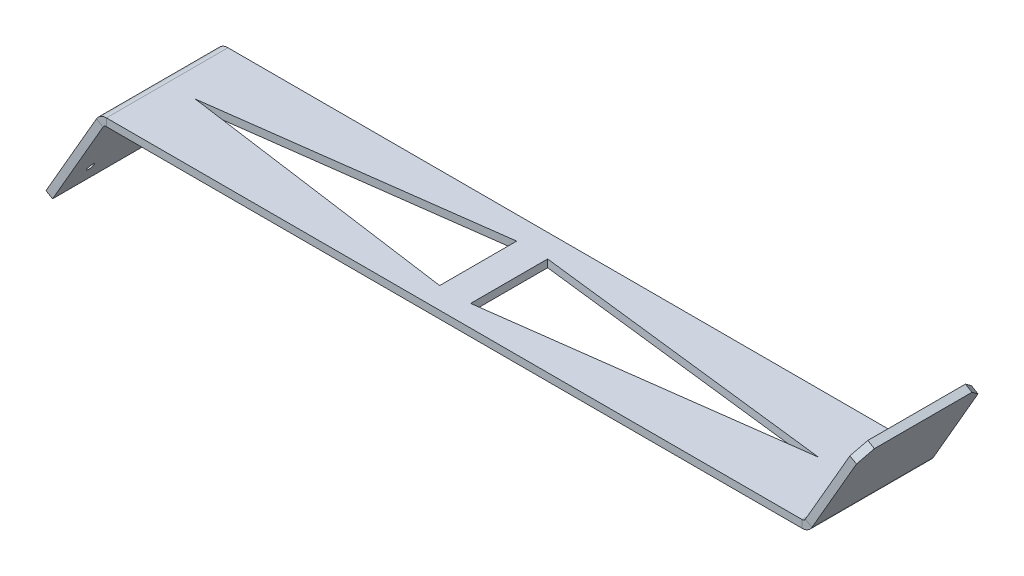
ISO-10303-21;
HEADER;
FILE_DESCRIPTION(('STEP AP214'),'2;1');
FILE_NAME('part.step','',(''),(''),'','','');
FILE_SCHEMA(('AUTOMOTIVE_DESIGN { 1 0 10303 214 1 1 1 1 }'));
ENDSEC;
DATA;
#1=APPLICATION_CONTEXT('core data for automotive mechanical design processes');
#2=APPLICATION_PROTOCOL_DEFINITION('international standard','automotive_design',2000,#1);
#3=PRODUCT_CONTEXT('',#1,'mechanical');
#4=PRODUCT('Part','Part','',(#3));
#5=PRODUCT_RELATED_PRODUCT_CATEGORY('part','',(#4));
#6=PRODUCT_DEFINITION_FORMATION('','',#4);
#7=PRODUCT_DEFINITION_CONTEXT('part definition',#1,'design');
#8=PRODUCT_DEFINITION('design','',#6,#7);
#9=PRODUCT_DEFINITION_SHAPE('','',#8);
#10=(LENGTH_UNIT() NAMED_UNIT(*) SI_UNIT(.MILLI.,.METRE.));
#11=(NAMED_UNIT(*) PLANE_ANGLE_UNIT() SI_UNIT($,.RADIAN.));
#12=(NAMED_UNIT(*) SI_UNIT($,.STERADIAN.) SOLID_ANGLE_UNIT());
#13=UNCERTAINTY_MEASURE_WITH_UNIT(LENGTH_MEASURE(1.E-05),#10,'distance_accuracy_value','');
#14=(GEOMETRIC_REPRESENTATION_CONTEXT(3) GLOBAL_UNCERTAINTY_ASSIGNED_CONTEXT((#13)) GLOBAL_UNIT_ASSIGNED_CONTEXT((#10,
#11,#12)) REPRESENTATION_CONTEXT('',''));
#15=CARTESIAN_POINT('',(0.,0.,0.));
#16=DIRECTION('',(0.,0.,1.));
#17=DIRECTION('',(1.,0.,0.));
#18=AXIS2_PLACEMENT_3D('',#15,#16,#17);
#19=CARTESIAN_POINT('',(-12.9100653599426,-31.9008891324553,-10.8));
#20=DIRECTION('',(-0.866025403784436,0.500000000000004,0.));
#21=DIRECTION('',(-0.500000000000004,-0.866025403784436,0.));
#22=AXIS2_PLACEMENT_3D('',#19,#20,#21);
#23=CYLINDRICAL_SURFACE('',#22,1.5);
#24=CARTESIAN_POINT('',(-12.9100653599426,-31.9008891324553,-10.8));
#25=DIRECTION('',(-0.866025403784436,0.500000000000004,0.));
#26=DIRECTION('',(-0.500000000000004,-0.866025403784436,0.));
#27=AXIS2_PLACEMENT_3D('',#24,#25,#26);
#28=CIRCLE('',#27,1.5);
#29=CARTESIAN_POINT('',(-13.6600653599426,-33.1999272381319,-10.8));
#30=VERTEX_POINT('',#29);
#31=EDGE_CURVE('E91',#30,#30,#28,.T.);
#32=ORIENTED_EDGE('',*,*,#31,.F.);
#33=EDGE_LOOP('',(#32));
#34=FACE_BOUND('',#33,.T.);
#35=CARTESIAN_POINT('',(-15.6640261439771,-30.3108891324553,-10.8));
#36=DIRECTION('',(-0.866025403784436,0.500000000000004,0.));
#37=DIRECTION('',(-0.500000000000004,-0.866025403784436,0.));
#38=AXIS2_PLACEMENT_3D('',#35,#36,#37);
#39=CIRCLE('',#38,1.5);
#40=CARTESIAN_POINT('',(-16.4140261439771,-31.6099272381319,-10.8));
#41=VERTEX_POINT('',#40);
#42=EDGE_CURVE('E13',#41,#41,#39,.T.);
#43=ORIENTED_EDGE('',*,*,#42,.T.);
#44=EDGE_LOOP('',(#43));
#45=FACE_BOUND('',#44,.T.);
#46=ADVANCED_FACE('F84',(#34,#45),#23,.F.);
#47=CARTESIAN_POINT('',(-0.410065359942499,-10.2502540378444,-10.8));
#48=DIRECTION('',(-0.866025403784436,0.500000000000004,0.));
#49=DIRECTION('',(-0.500000000000004,-0.866025403784436,0.));
#50=AXIS2_PLACEMENT_3D('',#47,#48,#49);
#51=CYLINDRICAL_SURFACE('',#50,1.5);
#52=CARTESIAN_POINT('',(-0.410065359942499,-10.2502540378444,-10.8));
#53=DIRECTION('',(-0.866025403784436,0.500000000000004,0.));
#54=DIRECTION('',(-0.500000000000004,-0.866025403784436,0.));
#55=AXIS2_PLACEMENT_3D('',#52,#53,#54);
#56=CIRCLE('',#55,1.5);
#57=CARTESIAN_POINT('',(-1.16006535994251,-11.549292143521,-10.8));
#58=VERTEX_POINT('',#57);
#59=EDGE_CURVE('E415',#58,#58,#56,.T.);
#60=ORIENTED_EDGE('',*,*,#59,.F.);
#61=EDGE_LOOP('',(#60));
#62=FACE_BOUND('',#61,.T.);
#63=CARTESIAN_POINT('',(-3.16402614397701,-8.66025403784436,-10.8));
#64=DIRECTION('',(-0.866025403784436,0.500000000000004,0.));
#65=DIRECTION('',(-0.500000000000004,-0.866025403784436,0.));
#66=AXIS2_PLACEMENT_3D('',#63,#64,#65);
#67=CIRCLE('',#66,1.5);
#68=CARTESIAN_POINT('',(-3.91402614397701,-9.95929214352102,-10.8));
#69=VERTEX_POINT('',#68);
#70=EDGE_CURVE('E418',#69,#69,#67,.T.);
#71=ORIENTED_EDGE('',*,*,#70,.T.);
#72=EDGE_LOOP('',(#71));
#73=FACE_BOUND('',#72,.T.);
#74=ADVANCED_FACE('F427',(#62,#73),#51,.F.);
#75=CARTESIAN_POINT('',(0.,-3.18,-50.8));
#76=DIRECTION('',(0.,0.,1.));
#77=DIRECTION('',(1.,0.,0.));
#78=AXIS2_PLACEMENT_3D('',#75,#76,#77);
#79=PLANE('',#78);
#80=DIRECTION('',(0.,1.,0.));
#81=VECTOR('',#80,1.);
#82=CARTESIAN_POINT('',(4.59570814274943,-3.18,-50.8));
#83=LINE('',#82,#81);
#84=CARTESIAN_POINT('',(4.59570814274943,-3.18,-50.8));
#85=VERTEX_POINT('',#84);
#86=CARTESIAN_POINT('',(4.59570814274943,0.,-50.8));
#87=VERTEX_POINT('',#86);
#88=EDGE_CURVE('E323',#85,#87,#83,.T.);
#89=ORIENTED_EDGE('',*,*,#88,.T.);
#90=DIRECTION('',(1.,0.,0.));
#91=VECTOR('',#90,1.);
#92=CARTESIAN_POINT('',(0.,0.,-50.8));
#93=LINE('',#92,#91);
#94=CARTESIAN_POINT('',(295.404291857251,0.,-50.8));
#95=VERTEX_POINT('',#94);
#96=EDGE_CURVE('E387',#87,#95,#93,.T.);
#97=ORIENTED_EDGE('',*,*,#96,.T.);
#98=DIRECTION('',(0.,-1.,0.));
#99=VECTOR('',#98,1.);
#100=CARTESIAN_POINT('',(295.404291857251,0.,-50.8));
#101=LINE('',#100,#99);
#102=CARTESIAN_POINT('',(295.404291857251,-3.17999999999998,-50.8));
#103=VERTEX_POINT('',#102);
#104=EDGE_CURVE('E373',#95,#103,#101,.T.);
#105=ORIENTED_EDGE('',*,*,#104,.T.);
#106=DIRECTION('',(1.,0.,0.));
#107=VECTOR('',#106,1.);
#108=CARTESIAN_POINT('',(0.,-3.18,-50.8));
#109=LINE('',#108,#107);
#110=EDGE_CURVE('E390',#85,#103,#109,.T.);
#111=ORIENTED_EDGE('',*,*,#110,.F.);
#112=EDGE_LOOP('',(#89,#97,#105,#111));
#113=FACE_BOUND('',#112,.T.);
#114=ADVANCED_FACE('F514',(#113),#79,.F.);
#115=CARTESIAN_POINT('',(0.,-3.18,0.));
#116=DIRECTION('',(0.,1.,0.));
#117=DIRECTION('',(0.,0.,1.));
#118=AXIS2_PLACEMENT_3D('',#115,#116,#117);
#119=PLANE('',#118);
#120=DIRECTION('',(0.,0.,-1.));
#121=VECTOR('',#120,1.);
#122=CARTESIAN_POINT('',(134.955518010446,-3.18,-41.1442253379052));
#123=LINE('',#122,#121);
#124=CARTESIAN_POINT('',(134.955518010446,-3.18,-8.95603131374358));
#125=VERTEX_POINT('',#124);
#126=CARTESIAN_POINT('',(134.955518010446,-3.18,-41.1442253379052));
#127=VERTEX_POINT('',#126);
#128=EDGE_CURVE('E98',#125,#127,#123,.T.);
#129=ORIENTED_EDGE('',*,*,#128,.T.);
#130=DIRECTION('',(-0.991304350761197,0.,0.131589073109894));
#131=VECTOR('',#130,1.);
#132=CARTESIAN_POINT('',(16.3490204648943,-3.18,-25.4));
#133=LINE('',#132,#131);
#134=CARTESIAN_POINT('',(16.3490204648943,-3.18,-25.4));
#135=VERTEX_POINT('',#134);
#136=EDGE_CURVE('E224',#127,#135,#133,.T.);
#137=ORIENTED_EDGE('',*,*,#136,.T.);
#138=DIRECTION('',(0.990525422689448,0.,0.137329483381722));
#139=VECTOR('',#138,1.);
#140=CARTESIAN_POINT('',(134.955518010446,-3.18,-8.95603131374358));
#141=LINE('',#140,#139);
#142=EDGE_CURVE('E233',#135,#125,#141,.T.);
#143=ORIENTED_EDGE('',*,*,#142,.T.);
#144=EDGE_LOOP('',(#129,#137,#143));
#145=FACE_BOUND('',#144,.T.);
#146=DIRECTION('',(0.991304350761197,0.,-0.131589073109894));
#147=VECTOR('',#146,1.);
#148=CARTESIAN_POINT('',(147.900769954946,-3.18,-8.95603131374358));
#149=LINE('',#148,#147);
#150=CARTESIAN_POINT('',(147.900769954946,-3.18,-8.95603131374358));
#151=VERTEX_POINT('',#150);
#152=CARTESIAN_POINT('',(276.270959733418,-3.18,-25.9963219923018));
#153=VERTEX_POINT('',#152);
#154=EDGE_CURVE('E106',#151,#153,#149,.T.);
#155=ORIENTED_EDGE('',*,*,#154,.T.);
#156=DIRECTION('',(-0.993109671771741,0.,-0.117188650616961));
#157=VECTOR('',#156,1.);
#158=CARTESIAN_POINT('',(276.270959733418,-3.18,-25.9963219923018));
#159=LINE('',#158,#157);
#160=CARTESIAN_POINT('',(147.900769954946,-3.18,-41.1442253379052));
#161=VERTEX_POINT('',#160);
#162=EDGE_CURVE('E253',#153,#161,#159,.T.);
#163=ORIENTED_EDGE('',*,*,#162,.T.);
#164=DIRECTION('',(0.,0.,1.));
#165=VECTOR('',#164,1.);
#166=CARTESIAN_POINT('',(147.900769954946,-3.18,-41.1442253379052));
#167=LINE('',#166,#165);
#168=EDGE_CURVE('E256',#161,#151,#167,.T.);
#169=ORIENTED_EDGE('',*,*,#168,.T.);
#170=EDGE_LOOP('',(#155,#163,#169));
#171=FACE_BOUND('',#170,.T.);
#172=DIRECTION('',(0.,0.,-1.));
#173=VECTOR('',#172,1.);
#174=CARTESIAN_POINT('',(4.59570814274943,-3.18,-50.8));
#175=LINE('',#174,#173);
#176=CARTESIAN_POINT('',(4.59570814274943,-3.18,0.));
#177=VERTEX_POINT('',#176);
#178=EDGE_CURVE('E329',#85,#177,#175,.F.);
#179=ORIENTED_EDGE('',*,*,#178,.F.);
#180=ORIENTED_EDGE('',*,*,#110,.T.);
#181=DIRECTION('',(0.,0.,-1.));
#182=VECTOR('',#181,1.);
#183=CARTESIAN_POINT('',(295.404291857251,-3.17999999999998,-50.8));
#184=LINE('',#183,#182);
#185=CARTESIAN_POINT('',(295.404291857251,-3.18,0.));
#186=VERTEX_POINT('',#185);
#187=EDGE_CURVE('E366',#103,#186,#184,.F.);
#188=ORIENTED_EDGE('',*,*,#187,.T.);
#189=DIRECTION('',(1.,0.,0.));
#190=VECTOR('',#189,1.);
#191=CARTESIAN_POINT('',(0.,-3.18,0.));
#192=LINE('',#191,#190);
#193=EDGE_CURVE('E392',#177,#186,#192,.T.);
#194=ORIENTED_EDGE('',*,*,#193,.F.);
#195=EDGE_LOOP('',(#179,#180,#188,#194));
#196=FACE_BOUND('',#195,.T.);
#197=ADVANCED_FACE('F237',(#145,#171,#196),#119,.F.);
#198=CARTESIAN_POINT('',(0.,0.,0.));
#199=DIRECTION('',(0.,1.,0.));
#200=DIRECTION('',(0.,0.,1.));
#201=AXIS2_PLACEMENT_3D('',#198,#199,#200);
#202=PLANE('',#201);
#203=DIRECTION('',(-0.991304350761197,0.,0.131589073109894));
#204=VECTOR('',#203,1.);
#205=CARTESIAN_POINT('',(16.3490204648943,0.,-25.4));
#206=LINE('',#205,#204);
#207=CARTESIAN_POINT('',(134.955518010446,0.,-41.1442253379052));
#208=VERTEX_POINT('',#207);
#209=CARTESIAN_POINT('',(16.3490204648943,0.,-25.4));
#210=VERTEX_POINT('',#209);
#211=EDGE_CURVE('E226',#208,#210,#206,.T.);
#212=ORIENTED_EDGE('',*,*,#211,.F.);
#213=DIRECTION('',(0.,0.,-1.));
#214=VECTOR('',#213,1.);
#215=CARTESIAN_POINT('',(134.955518010446,0.,-41.1442253379052));
#216=LINE('',#215,#214);
#217=CARTESIAN_POINT('',(134.955518010446,0.,-8.95603131374358));
#218=VERTEX_POINT('',#217);
#219=EDGE_CURVE('E239',#218,#208,#216,.T.);
#220=ORIENTED_EDGE('',*,*,#219,.F.);
#221=DIRECTION('',(0.990525422689448,0.,0.137329483381722));
#222=VECTOR('',#221,1.);
#223=CARTESIAN_POINT('',(134.955518010446,0.,-8.95603131374358));
#224=LINE('',#223,#222);
#225=EDGE_CURVE('E242',#210,#218,#224,.T.);
#226=ORIENTED_EDGE('',*,*,#225,.F.);
#227=EDGE_LOOP('',(#212,#220,#226));
#228=FACE_BOUND('',#227,.T.);
#229=DIRECTION('',(-0.993109671771741,0.,-0.117188650616961));
#230=VECTOR('',#229,1.);
#231=CARTESIAN_POINT('',(276.270959733418,0.,-25.9963219923018));
#232=LINE('',#231,#230);
#233=CARTESIAN_POINT('',(276.270959733418,0.,-25.9963219923018));
#234=VERTEX_POINT('',#233);
#235=CARTESIAN_POINT('',(147.900769954946,0.,-41.1442253379052));
#236=VERTEX_POINT('',#235);
#237=EDGE_CURVE('E262',#234,#236,#232,.T.);
#238=ORIENTED_EDGE('',*,*,#237,.F.);
#239=DIRECTION('',(0.991304350761197,0.,-0.131589073109894));
#240=VECTOR('',#239,1.);
#241=CARTESIAN_POINT('',(147.900769954946,0.,-8.95603131374358));
#242=LINE('',#241,#240);
#243=CARTESIAN_POINT('',(147.900769954946,0.,-8.95603131374358));
#244=VERTEX_POINT('',#243);
#245=EDGE_CURVE('E257',#244,#234,#242,.T.);
#246=ORIENTED_EDGE('',*,*,#245,.F.);
#247=DIRECTION('',(0.,0.,1.));
#248=VECTOR('',#247,1.);
#249=CARTESIAN_POINT('',(147.900769954946,0.,-41.1442253379052));
#250=LINE('',#249,#248);
#251=EDGE_CURVE('E264',#236,#244,#250,.T.);
#252=ORIENTED_EDGE('',*,*,#251,.F.);
#253=EDGE_LOOP('',(#238,#246,#252));
#254=FACE_BOUND('',#253,.T.);
#255=ORIENTED_EDGE('',*,*,#96,.F.);
#256=DIRECTION('',(0.,0.,-1.));
#257=VECTOR('',#256,1.);
#258=CARTESIAN_POINT('',(4.59570814274943,0.,-50.8));
#259=LINE('',#258,#257);
#260=CARTESIAN_POINT('',(4.59570814274943,0.,0.));
#261=VERTEX_POINT('',#260);
#262=EDGE_CURVE('E316',#87,#261,#259,.F.);
#263=ORIENTED_EDGE('',*,*,#262,.T.);
#264=DIRECTION('',(1.,0.,0.));
#265=VECTOR('',#264,1.);
#266=CARTESIAN_POINT('',(0.,0.,0.));
#267=LINE('',#266,#265);
#268=CARTESIAN_POINT('',(295.404291857251,0.,0.));
#269=VERTEX_POINT('',#268);
#270=EDGE_CURVE('E393',#261,#269,#267,.T.);
#271=ORIENTED_EDGE('',*,*,#270,.T.);
#272=DIRECTION('',(0.,0.,-1.));
#273=VECTOR('',#272,1.);
#274=CARTESIAN_POINT('',(295.404291857251,0.,-50.8));
#275=LINE('',#274,#273);
#276=EDGE_CURVE('E379',#95,#269,#275,.F.);
#277=ORIENTED_EDGE('',*,*,#276,.F.);
#278=EDGE_LOOP('',(#255,#263,#271,#277));
#279=FACE_BOUND('',#278,.T.);
#280=ADVANCED_FACE('F513',(#228,#254,#279),#202,.T.);
#281=CARTESIAN_POINT('',(0.,-3.18,0.));
#282=DIRECTION('',(0.,0.,1.));
#283=DIRECTION('',(1.,0.,0.));
#284=AXIS2_PLACEMENT_3D('',#281,#282,#283);
#285=PLANE('',#284);
#286=DIRECTION('',(0.,1.,0.));
#287=VECTOR('',#286,1.);
#288=CARTESIAN_POINT('',(4.59570814274943,-3.18,0.));
#289=LINE('',#288,#287);
#290=EDGE_CURVE('E333',#177,#261,#289,.T.);
#291=ORIENTED_EDGE('',*,*,#290,.F.);
#292=ORIENTED_EDGE('',*,*,#193,.T.);
#293=DIRECTION('',(0.,-1.,0.));
#294=VECTOR('',#293,1.);
#295=CARTESIAN_POINT('',(295.404291857251,0.,0.));
#296=LINE('',#295,#294);
#297=EDGE_CURVE('E384',#269,#186,#296,.T.);
#298=ORIENTED_EDGE('',*,*,#297,.F.);
#299=ORIENTED_EDGE('',*,*,#270,.F.);
#300=EDGE_LOOP('',(#291,#292,#298,#299));
#301=FACE_BOUND('',#300,.T.);
#302=ADVANCED_FACE('F506',(#301),#285,.T.);
#303=CARTESIAN_POINT('',(295.404291857251,1.60000000000003,0.));
#304=DIRECTION('',(0.,0.,1.));
#305=DIRECTION('',(0.,-1.,0.));
#306=AXIS2_PLACEMENT_3D('',#303,#304,#305);
#307=PLANE('',#306);
#308=DIRECTION('',(-0.866025403784437,0.500000000000004,0.));
#309=VECTOR('',#308,1.);
#310=CARTESIAN_POINT('',(299.54389328734,-0.789999999999968,0.));
#311=LINE('',#310,#309);
#312=CARTESIAN_POINT('',(296.789932503306,0.800000000000016,0.));
#313=VERTEX_POINT('',#312);
#314=CARTESIAN_POINT('',(299.54389328734,-0.789999999999987,0.));
#315=VERTEX_POINT('',#314);
#316=EDGE_CURVE('E336',#313,#315,#311,.F.);
#317=ORIENTED_EDGE('',*,*,#316,.F.);
#318=CARTESIAN_POINT('',(295.404291857251,1.60000000000003,0.));
#319=DIRECTION('',(0.,0.,-1.));
#320=DIRECTION('',(0.,1.,0.));
#321=AXIS2_PLACEMENT_3D('',#318,#319,#320);
#322=CIRCLE('',#321,1.60000000000002);
#323=EDGE_CURVE('E376',#269,#313,#322,.F.);
#324=ORIENTED_EDGE('',*,*,#323,.F.);
#325=ORIENTED_EDGE('',*,*,#297,.T.);
#326=CARTESIAN_POINT('',(295.404291857251,1.60000000000003,0.));
#327=DIRECTION('',(0.,0.,-1.));
#328=DIRECTION('',(0.,1.,0.));
#329=AXIS2_PLACEMENT_3D('',#326,#327,#328);
#330=CIRCLE('',#329,4.78000000000002);
#331=EDGE_CURVE('E369',#186,#315,#330,.F.);
#332=ORIENTED_EDGE('',*,*,#331,.T.);
#333=EDGE_LOOP('',(#317,#324,#325,#332));
#334=FACE_BOUND('',#333,.T.);
#335=ADVANCED_FACE('F503',(#334),#307,.T.);
#336=CARTESIAN_POINT('',(295.404291857251,1.60000000000003,-50.8));
#337=DIRECTION('',(0.,0.,1.));
#338=DIRECTION('',(0.,-1.,0.));
#339=AXIS2_PLACEMENT_3D('',#336,#337,#338);
#340=PLANE('',#339);
#341=CARTESIAN_POINT('',(295.404291857251,1.60000000000003,-50.8));
#342=DIRECTION('',(0.,0.,-1.));
#343=DIRECTION('',(0.,1.,0.));
#344=AXIS2_PLACEMENT_3D('',#341,#342,#343);
#345=CIRCLE('',#344,1.60000000000002);
#346=CARTESIAN_POINT('',(296.789932503306,0.80000000000002,-50.8));
#347=VERTEX_POINT('',#346);
#348=EDGE_CURVE('E342',#347,#95,#345,.T.);
#349=ORIENTED_EDGE('',*,*,#348,.F.);
#350=DIRECTION('',(-0.866025403784437,0.500000000000004,0.));
#351=VECTOR('',#350,1.);
#352=CARTESIAN_POINT('',(296.789932503306,0.800000000000078,-50.8));
#353=LINE('',#352,#351);
#354=CARTESIAN_POINT('',(299.54389328734,-0.790000000000018,-50.8));
#355=VERTEX_POINT('',#354);
#356=EDGE_CURVE('E359',#347,#355,#353,.F.);
#357=ORIENTED_EDGE('',*,*,#356,.T.);
#358=CARTESIAN_POINT('',(295.404291857251,1.60000000000003,-50.8));
#359=DIRECTION('',(0.,0.,-1.));
#360=DIRECTION('',(0.,1.,0.));
#361=AXIS2_PLACEMENT_3D('',#358,#359,#360);
#362=CIRCLE('',#361,4.78000000000002);
#363=EDGE_CURVE('E370',#355,#103,#362,.T.);
#364=ORIENTED_EDGE('',*,*,#363,.T.);
#365=ORIENTED_EDGE('',*,*,#104,.F.);
#366=EDGE_LOOP('',(#349,#357,#364,#365));
#367=FACE_BOUND('',#366,.T.);
#368=ADVANCED_FACE('F498',(#367),#340,.F.);
#369=CARTESIAN_POINT('',(295.404291857251,1.60000000000003,-50.8));
#370=DIRECTION('',(0.,0.,-1.));
#371=DIRECTION('',(0.866025403784436,-0.500000000000004,0.));
#372=AXIS2_PLACEMENT_3D('',#369,#370,#371);
#373=CYLINDRICAL_SURFACE('',#372,4.78000000000002);
#374=ORIENTED_EDGE('',*,*,#187,.F.);
#375=ORIENTED_EDGE('',*,*,#363,.F.);
#376=DIRECTION('',(0.,0.,-1.));
#377=VECTOR('',#376,1.);
#378=CARTESIAN_POINT('',(299.54389328734,-0.790000000000017,0.));
#379=LINE('',#378,#377);
#380=EDGE_CURVE('E356',#355,#315,#379,.F.);
#381=ORIENTED_EDGE('',*,*,#380,.T.);
#382=ORIENTED_EDGE('',*,*,#331,.F.);
#383=EDGE_LOOP('',(#374,#375,#381,#382));
#384=FACE_BOUND('',#383,.T.);
#385=ADVANCED_FACE('F495',(#384),#373,.T.);
#386=CARTESIAN_POINT('',(295.404291857251,1.60000000000003,-50.8));
#387=DIRECTION('',(0.,0.,-1.));
#388=DIRECTION('',(0.866025403784436,-0.500000000000004,0.));
#389=AXIS2_PLACEMENT_3D('',#386,#387,#388);
#390=CYLINDRICAL_SURFACE('',#389,1.60000000000002);
#391=ORIENTED_EDGE('',*,*,#276,.T.);
#392=ORIENTED_EDGE('',*,*,#323,.T.);
#393=DIRECTION('',(0.,0.,-1.));
#394=VECTOR('',#393,1.);
#395=CARTESIAN_POINT('',(296.789932503306,0.800000000000078,0.));
#396=LINE('',#395,#394);
#397=EDGE_CURVE('E362',#313,#347,#396,.T.);
#398=ORIENTED_EDGE('',*,*,#397,.T.);
#399=ORIENTED_EDGE('',*,*,#348,.T.);
#400=EDGE_LOOP('',(#391,#392,#398,#399));
#401=FACE_BOUND('',#400,.T.);
#402=ADVANCED_FACE('F493',(#401),#390,.F.);
#403=CARTESIAN_POINT('',(299.082013071988,-1.58999999999999,0.));
#404=DIRECTION('',(0.,0.,-1.));
#405=DIRECTION('',(-1.,0.,0.));
#406=AXIS2_PLACEMENT_3D('',#403,#404,#405);
#407=PLANE('',#406);
#408=DIRECTION('',(-0.500000000000004,-0.866025403784436,0.));
#409=VECTOR('',#408,1.);
#410=CARTESIAN_POINT('',(224.082013071987,-131.493810567666,0.));
#411=LINE('',#410,#409);
#412=CARTESIAN_POINT('',(318.164026143977,31.4610161513774,0.));
#413=VERTEX_POINT('',#412);
#414=EDGE_CURVE('E346',#413,#315,#411,.T.);
#415=ORIENTED_EDGE('',*,*,#414,.F.);
#416=DIRECTION('',(-0.866025403784436,0.500000000000004,0.));
#417=VECTOR('',#416,1.);
#418=CARTESIAN_POINT('',(318.164026143977,31.4610161513774,0.));
#419=LINE('',#418,#417);
#420=CARTESIAN_POINT('',(315.410065359943,33.0510161513774,0.));
#421=VERTEX_POINT('',#420);
#422=EDGE_CURVE('E406',#413,#421,#419,.T.);
#423=ORIENTED_EDGE('',*,*,#422,.T.);
#424=DIRECTION('',(0.500000000000004,0.866025403784436,0.));
#425=VECTOR('',#424,1.);
#426=CARTESIAN_POINT('',(296.328052287954,0.,0.));
#427=LINE('',#426,#425);
#428=EDGE_CURVE('E354',#421,#313,#427,.F.);
#429=ORIENTED_EDGE('',*,*,#428,.T.);
#430=ORIENTED_EDGE('',*,*,#316,.T.);
#431=EDGE_LOOP('',(#415,#423,#429,#430));
#432=FACE_BOUND('',#431,.T.);
#433=ADVANCED_FACE('F489',(#432),#407,.F.);
#434=CARTESIAN_POINT('',(320.664026143977,35.7911431702997,-50.8));
#435=DIRECTION('',(0.,0.,1.));
#436=DIRECTION('',(0.,-1.,0.));
#437=AXIS2_PLACEMENT_3D('',#434,#435,#436);
#438=PLANE('',#437);
#439=DIRECTION('',(-0.500000000000004,-0.866025403784436,0.));
#440=VECTOR('',#439,1.);
#441=CARTESIAN_POINT('',(317.910065359943,37.3811431702996,-50.8));
#442=LINE('',#441,#440);
#443=CARTESIAN_POINT('',(315.410065359943,33.0510161513774,-50.8));
#444=VERTEX_POINT('',#443);
#445=EDGE_CURVE('E351',#347,#444,#442,.F.);
#446=ORIENTED_EDGE('',*,*,#445,.T.);
#447=DIRECTION('',(0.866025403784436,-0.500000000000004,0.));
#448=VECTOR('',#447,1.);
#449=CARTESIAN_POINT('',(318.164026143977,31.4610161513774,-50.8));
#450=LINE('',#449,#448);
#451=CARTESIAN_POINT('',(318.164026143977,31.4610161513774,-50.8));
#452=VERTEX_POINT('',#451);
#453=EDGE_CURVE('E402',#444,#452,#450,.T.);
#454=ORIENTED_EDGE('',*,*,#453,.T.);
#455=DIRECTION('',(0.500000000000004,0.866025403784436,0.));
#456=VECTOR('',#455,1.);
#457=CARTESIAN_POINT('',(224.082013071987,-131.493810567666,-50.8));
#458=LINE('',#457,#456);
#459=EDGE_CURVE('E343',#355,#452,#458,.T.);
#460=ORIENTED_EDGE('',*,*,#459,.F.);
#461=ORIENTED_EDGE('',*,*,#356,.F.);
#462=EDGE_LOOP('',(#446,#454,#460,#461));
#463=FACE_BOUND('',#462,.T.);
#464=ADVANCED_FACE('F479',(#463),#438,.F.);
#465=CARTESIAN_POINT('',(224.082013071987,-131.493810567666,0.));
#466=DIRECTION('',(-0.866025403784437,0.500000000000004,0.));
#467=DIRECTION('',(-0.500000000000004,-0.866025403784436,0.));
#468=AXIS2_PLACEMENT_3D('',#465,#466,#467);
#469=PLANE('',#468);
#470=DIRECTION('',(0.,0.,1.));
#471=VECTOR('',#470,1.);
#472=CARTESIAN_POINT('',(320.664026143977,35.7911431702996,0.));
#473=LINE('',#472,#471);
#474=CARTESIAN_POINT('',(320.664026143977,35.7911431702996,-45.8));
#475=VERTEX_POINT('',#474);
#476=CARTESIAN_POINT('',(320.664026143977,35.7911431702996,-5.00000000000004));
#477=VERTEX_POINT('',#476);
#478=EDGE_CURVE('E339',#475,#477,#473,.T.);
#479=ORIENTED_EDGE('',*,*,#478,.T.);
#480=DIRECTION('',(0.353553390593276,0.612372435695793,-0.707106781186548));
#481=VECTOR('',#480,1.);
#482=CARTESIAN_POINT('',(318.164026143977,31.4610161513774,0.));
#483=LINE('',#482,#481);
#484=EDGE_CURVE('E413',#477,#413,#483,.F.);
#485=ORIENTED_EDGE('',*,*,#484,.T.);
#486=ORIENTED_EDGE('',*,*,#414,.T.);
#487=ORIENTED_EDGE('',*,*,#380,.F.);
#488=ORIENTED_EDGE('',*,*,#459,.T.);
#489=DIRECTION('',(-0.353553390593277,-0.612372435695795,-0.707106781186546));
#490=VECTOR('',#489,1.);
#491=CARTESIAN_POINT('',(320.664026143977,35.7911431702997,-45.8));
#492=LINE('',#491,#490);
#493=EDGE_CURVE('E404',#452,#475,#492,.F.);
#494=ORIENTED_EDGE('',*,*,#493,.T.);
#495=EDGE_LOOP('',(#479,#485,#486,#487,#488,#494));
#496=FACE_BOUND('',#495,.T.);
#497=ADVANCED_FACE('F475',(#496),#469,.F.);
#498=CARTESIAN_POINT('',(221.328052287953,-129.903810567666,0.));
#499=DIRECTION('',(-0.866025403784437,0.500000000000004,0.));
#500=DIRECTION('',(-0.500000000000004,-0.866025403784436,0.));
#501=AXIS2_PLACEMENT_3D('',#498,#499,#500);
#502=PLANE('',#501);
#503=ORIENTED_EDGE('',*,*,#428,.F.);
#504=DIRECTION('',(-0.353553390593276,-0.612372435695793,0.707106781186548));
#505=VECTOR('',#504,1.);
#506=CARTESIAN_POINT('',(268.369058823948,-48.4263972081444,94.082013071989));
#507=LINE('',#506,#505);
#508=CARTESIAN_POINT('',(317.910065359943,37.3811431702996,-5.00000000000004));
#509=VERTEX_POINT('',#508);
#510=EDGE_CURVE('E409',#421,#509,#507,.F.);
#511=ORIENTED_EDGE('',*,*,#510,.T.);
#512=DIRECTION('',(0.,0.,-1.));
#513=VECTOR('',#512,1.);
#514=CARTESIAN_POINT('',(317.910065359943,37.3811431702996,0.));
#515=LINE('',#514,#513);
#516=CARTESIAN_POINT('',(317.910065359943,37.3811431702996,-45.8));
#517=VERTEX_POINT('',#516);
#518=EDGE_CURVE('E348',#517,#509,#515,.F.);
#519=ORIENTED_EDGE('',*,*,#518,.F.);
#520=DIRECTION('',(0.353553390593277,0.612372435695795,0.707106781186546));
#521=VECTOR('',#520,1.);
#522=CARTESIAN_POINT('',(281.069058823948,-26.4293519520202,-119.482013071989));
#523=LINE('',#522,#521);
#524=EDGE_CURVE('E400',#517,#444,#523,.F.);
#525=ORIENTED_EDGE('',*,*,#524,.T.);
#526=ORIENTED_EDGE('',*,*,#445,.F.);
#527=ORIENTED_EDGE('',*,*,#397,.F.);
#528=EDGE_LOOP('',(#503,#511,#519,#525,#526,#527));
#529=FACE_BOUND('',#528,.T.);
#530=ADVANCED_FACE('F478',(#529),#502,.T.);
#531=CARTESIAN_POINT('',(320.664026143977,35.7911431702997,0.));
#532=DIRECTION('',(-0.500000000000004,-0.866025403784436,0.));
#533=DIRECTION('',(0.866025403784436,-0.500000000000004,0.));
#534=AXIS2_PLACEMENT_3D('',#531,#532,#533);
#535=PLANE('',#534);
#536=ORIENTED_EDGE('',*,*,#518,.T.);
#537=DIRECTION('',(0.866025403784436,-0.500000000000004,0.));
#538=VECTOR('',#537,1.);
#539=CARTESIAN_POINT('',(320.664026143977,35.7911431702997,-5.00000000000004));
#540=LINE('',#539,#538);
#541=EDGE_CURVE('E411',#509,#477,#540,.T.);
#542=ORIENTED_EDGE('',*,*,#541,.T.);
#543=ORIENTED_EDGE('',*,*,#478,.F.);
#544=DIRECTION('',(-0.866025403784436,0.500000000000004,0.));
#545=VECTOR('',#544,1.);
#546=CARTESIAN_POINT('',(320.664026143977,35.7911431702997,-45.8));
#547=LINE('',#546,#545);
#548=EDGE_CURVE('E395',#475,#517,#547,.T.);
#549=ORIENTED_EDGE('',*,*,#548,.T.);
#550=EDGE_LOOP('',(#536,#542,#543,#549));
#551=FACE_BOUND('',#550,.T.);
#552=ADVANCED_FACE('F470',(#551),#535,.F.);
#553=CARTESIAN_POINT('',(4.59570814274943,-4.78,0.));
#554=DIRECTION('',(0.,0.,1.));
#555=DIRECTION('',(1.,0.,0.));
#556=AXIS2_PLACEMENT_3D('',#553,#554,#555);
#557=PLANE('',#556);
#558=DIRECTION('',(0.866025403784436,-0.500000000000004,0.));
#559=VECTOR('',#558,1.);
#560=CARTESIAN_POINT('',(0.45610671265982,-2.38999999999998,0.));
#561=LINE('',#560,#559);
#562=CARTESIAN_POINT('',(3.21006749669433,-3.97999999999999,0.));
#563=VERTEX_POINT('',#562);
#564=CARTESIAN_POINT('',(0.456106712659822,-2.38999999999998,0.));
#565=VERTEX_POINT('',#564);
#566=EDGE_CURVE('E283',#563,#565,#561,.F.);
#567=ORIENTED_EDGE('',*,*,#566,.F.);
#568=CARTESIAN_POINT('',(4.59570814274943,-4.78,0.));
#569=DIRECTION('',(0.,0.,-1.));
#570=DIRECTION('',(-1.,0.,0.));
#571=AXIS2_PLACEMENT_3D('',#568,#569,#570);
#572=CIRCLE('',#571,1.6);
#573=EDGE_CURVE('E326',#177,#563,#572,.F.);
#574=ORIENTED_EDGE('',*,*,#573,.F.);
#575=ORIENTED_EDGE('',*,*,#290,.T.);
#576=CARTESIAN_POINT('',(4.59570814274943,-4.78,0.));
#577=DIRECTION('',(0.,0.,-1.));
#578=DIRECTION('',(-1.,0.,0.));
#579=AXIS2_PLACEMENT_3D('',#576,#577,#578);
#580=CIRCLE('',#579,4.78);
#581=EDGE_CURVE('E319',#261,#565,#580,.F.);
#582=ORIENTED_EDGE('',*,*,#581,.T.);
#583=EDGE_LOOP('',(#567,#574,#575,#582));
#584=FACE_BOUND('',#583,.T.);
#585=ADVANCED_FACE('F467',(#584),#557,.T.);
#586=CARTESIAN_POINT('',(4.59570814274943,-4.78,-50.8));
#587=DIRECTION('',(0.,0.,1.));
#588=DIRECTION('',(1.,0.,0.));
#589=AXIS2_PLACEMENT_3D('',#586,#587,#588);
#590=PLANE('',#589);
#591=CARTESIAN_POINT('',(4.59570814274943,-4.78,-50.8));
#592=DIRECTION('',(0.,0.,-1.));
#593=DIRECTION('',(-1.,0.,0.));
#594=AXIS2_PLACEMENT_3D('',#591,#592,#593);
#595=CIRCLE('',#594,1.6);
#596=CARTESIAN_POINT('',(3.21006749669433,-3.97999999999999,-50.8));
#597=VERTEX_POINT('',#596);
#598=EDGE_CURVE('E289',#597,#85,#595,.T.);
#599=ORIENTED_EDGE('',*,*,#598,.F.);
#600=DIRECTION('',(0.866025403784436,-0.500000000000004,0.));
#601=VECTOR('',#600,1.);
#602=CARTESIAN_POINT('',(3.21006749669433,-3.97999999999999,-50.8));
#603=LINE('',#602,#601);
#604=CARTESIAN_POINT('',(0.456106712659823,-2.38999999999998,-50.8));
#605=VERTEX_POINT('',#604);
#606=EDGE_CURVE('E309',#597,#605,#603,.F.);
#607=ORIENTED_EDGE('',*,*,#606,.T.);
#608=CARTESIAN_POINT('',(4.59570814274943,-4.78,-50.8));
#609=DIRECTION('',(0.,0.,-1.));
#610=DIRECTION('',(-1.,0.,0.));
#611=AXIS2_PLACEMENT_3D('',#608,#609,#610);
#612=CIRCLE('',#611,4.78);
#613=EDGE_CURVE('E320',#605,#87,#612,.T.);
#614=ORIENTED_EDGE('',*,*,#613,.T.);
#615=ORIENTED_EDGE('',*,*,#88,.F.);
#616=EDGE_LOOP('',(#599,#607,#614,#615));
#617=FACE_BOUND('',#616,.T.);
#618=ADVANCED_FACE('F462',(#617),#590,.F.);
#619=CARTESIAN_POINT('',(4.59570814274943,-4.78,-50.8));
#620=DIRECTION('',(0.,0.,-1.));
#621=DIRECTION('',(-0.866025403784436,0.500000000000004,0.));
#622=AXIS2_PLACEMENT_3D('',#619,#620,#621);
#623=CYLINDRICAL_SURFACE('',#622,4.78);
#624=ORIENTED_EDGE('',*,*,#262,.F.);
#625=ORIENTED_EDGE('',*,*,#613,.F.);
#626=DIRECTION('',(0.,0.,-1.));
#627=VECTOR('',#626,1.);
#628=CARTESIAN_POINT('',(0.456106712659823,-2.38999999999998,0.));
#629=LINE('',#628,#627);
#630=EDGE_CURVE('E307',#605,#565,#629,.F.);
#631=ORIENTED_EDGE('',*,*,#630,.T.);
#632=ORIENTED_EDGE('',*,*,#581,.F.);
#633=EDGE_LOOP('',(#624,#625,#631,#632));
#634=FACE_BOUND('',#633,.T.);
#635=ADVANCED_FACE('F459',(#634),#623,.T.);
#636=CARTESIAN_POINT('',(4.59570814274943,-4.78,-50.8));
#637=DIRECTION('',(0.,0.,-1.));
#638=DIRECTION('',(-0.866025403784436,0.500000000000004,0.));
#639=AXIS2_PLACEMENT_3D('',#636,#637,#638);
#640=CYLINDRICAL_SURFACE('',#639,1.6);
#641=ORIENTED_EDGE('',*,*,#178,.T.);
#642=ORIENTED_EDGE('',*,*,#573,.T.);
#643=DIRECTION('',(0.,0.,-1.));
#644=VECTOR('',#643,1.);
#645=CARTESIAN_POINT('',(3.21006749669433,-3.97999999999999,0.));
#646=LINE('',#645,#644);
#647=EDGE_CURVE('E312',#563,#597,#646,.T.);
#648=ORIENTED_EDGE('',*,*,#647,.T.);
#649=ORIENTED_EDGE('',*,*,#598,.T.);
#650=EDGE_LOOP('',(#641,#642,#648,#649));
#651=FACE_BOUND('',#650,.T.);
#652=ADVANCED_FACE('F457',(#651),#640,.F.);
#653=CARTESIAN_POINT('',(0.917986928011522,-1.58999999999999,0.));
#654=DIRECTION('',(0.,0.,-1.));
#655=DIRECTION('',(-1.,0.,0.));
#656=AXIS2_PLACEMENT_3D('',#653,#654,#655);
#657=PLANE('',#656);
#658=ORIENTED_EDGE('',*,*,#566,.T.);
#659=DIRECTION('',(0.500000000000004,0.866025403784436,0.));
#660=VECTOR('',#659,1.);
#661=CARTESIAN_POINT('',(2.29496732002879,0.794999999999999,0.));
#662=LINE('',#661,#660);
#663=CARTESIAN_POINT('',(-20.6640261439771,-38.9711431702996,0.));
#664=VERTEX_POINT('',#663);
#665=EDGE_CURVE('E297',#664,#565,#662,.T.);
#666=ORIENTED_EDGE('',*,*,#665,.F.);
#667=DIRECTION('',(0.866025403784436,-0.500000000000004,0.));
#668=VECTOR('',#667,1.);
#669=CARTESIAN_POINT('',(-20.6640261439771,-38.9711431702996,0.));
#670=LINE('',#669,#668);
#671=CARTESIAN_POINT('',(-17.9100653599426,-40.5611431702996,0.));
#672=VERTEX_POINT('',#671);
#673=EDGE_CURVE('E290',#664,#672,#670,.T.);
#674=ORIENTED_EDGE('',*,*,#673,.T.);
#675=DIRECTION('',(-0.500000000000004,-0.866025403784436,0.));
#676=VECTOR('',#675,1.);
#677=CARTESIAN_POINT('',(3.67194771204603,-3.18,0.));
#678=LINE('',#677,#676);
#679=EDGE_CURVE('E304',#672,#563,#678,.F.);
#680=ORIENTED_EDGE('',*,*,#679,.T.);
#681=EDGE_LOOP('',(#658,#666,#674,#680));
#682=FACE_BOUND('',#681,.T.);
#683=ADVANCED_FACE('F442',(#682),#657,.F.);
#684=CARTESIAN_POINT('',(-20.6640261439771,-38.9711431702996,-50.8));
#685=DIRECTION('',(0.,0.,1.));
#686=DIRECTION('',(0.,-1.,0.));
#687=AXIS2_PLACEMENT_3D('',#684,#685,#686);
#688=PLANE('',#687);
#689=ORIENTED_EDGE('',*,*,#606,.F.);
#690=DIRECTION('',(0.500000000000004,0.866025403784436,0.));
#691=VECTOR('',#690,1.);
#692=CARTESIAN_POINT('',(-17.9100653599426,-40.5611431702996,-50.8));
#693=LINE('',#692,#691);
#694=CARTESIAN_POINT('',(-17.9100653599426,-40.5611431702996,-50.8));
#695=VERTEX_POINT('',#694);
#696=EDGE_CURVE('E302',#597,#695,#693,.F.);
#697=ORIENTED_EDGE('',*,*,#696,.T.);
#698=DIRECTION('',(0.866025403784436,-0.500000000000004,0.));
#699=VECTOR('',#698,1.);
#700=CARTESIAN_POINT('',(-20.6640261439771,-38.9711431702996,-50.8));
#701=LINE('',#700,#699);
#702=CARTESIAN_POINT('',(-20.6640261439771,-38.9711431702996,-50.8));
#703=VERTEX_POINT('',#702);
#704=EDGE_CURVE('E286',#703,#695,#701,.T.);
#705=ORIENTED_EDGE('',*,*,#704,.F.);
#706=DIRECTION('',(-0.500000000000004,-0.866025403784436,0.));
#707=VECTOR('',#706,1.);
#708=CARTESIAN_POINT('',(2.29496732002879,0.794999999999992,-50.8));
#709=LINE('',#708,#707);
#710=EDGE_CURVE('E295',#605,#703,#709,.T.);
#711=ORIENTED_EDGE('',*,*,#710,.F.);
#712=EDGE_LOOP('',(#689,#697,#705,#711));
#713=FACE_BOUND('',#712,.T.);
#714=ADVANCED_FACE('F432',(#713),#688,.F.);
#715=CARTESIAN_POINT('',(2.29496732002879,0.794999999999999,0.));
#716=DIRECTION('',(0.866025403784436,-0.500000000000004,0.));
#717=DIRECTION('',(0.500000000000004,0.866025403784436,0.));
#718=AXIS2_PLACEMENT_3D('',#715,#716,#717);
#719=PLANE('',#718);
#720=CARTESIAN_POINT('',(-15.6640261439771,-30.3108891324553,-40.8));
#721=DIRECTION('',(-0.866025403784436,0.500000000000004,0.));
#722=DIRECTION('',(-0.500000000000004,-0.866025403784436,0.));
#723=AXIS2_PLACEMENT_3D('',#720,#721,#722);
#724=CIRCLE('',#723,1.5);
#725=CARTESIAN_POINT('',(-16.4140261439771,-31.6099272381319,-40.8));
#726=VERTEX_POINT('',#725);
#727=EDGE_CURVE('E276',#726,#726,#724,.T.);
#728=ORIENTED_EDGE('',*,*,#727,.F.);
#729=EDGE_LOOP('',(#728));
#730=FACE_BOUND('',#729,.T.);
#731=CARTESIAN_POINT('',(-3.16402614397701,-8.66025403784436,-40.8));
#732=DIRECTION('',(-0.866025403784436,0.500000000000004,0.));
#733=DIRECTION('',(-0.500000000000004,-0.866025403784436,0.));
#734=AXIS2_PLACEMENT_3D('',#731,#732,#733);
#735=CIRCLE('',#734,1.5);
#736=CARTESIAN_POINT('',(-3.91402614397701,-9.95929214352102,-40.8));
#737=VERTEX_POINT('',#736);
#738=EDGE_CURVE('E279',#737,#737,#735,.T.);
#739=ORIENTED_EDGE('',*,*,#738,.F.);
#740=EDGE_LOOP('',(#739));
#741=FACE_BOUND('',#740,.T.);
#742=ORIENTED_EDGE('',*,*,#630,.F.);
#743=ORIENTED_EDGE('',*,*,#710,.T.);
#744=DIRECTION('',(0.,0.,1.));
#745=VECTOR('',#744,1.);
#746=CARTESIAN_POINT('',(-20.6640261439771,-38.9711431702996,0.));
#747=LINE('',#746,#745);
#748=EDGE_CURVE('E293',#703,#664,#747,.T.);
#749=ORIENTED_EDGE('',*,*,#748,.T.);
#750=ORIENTED_EDGE('',*,*,#665,.T.);
#751=EDGE_LOOP('',(#742,#743,#749,#750));
#752=FACE_BOUND('',#751,.T.);
#753=ORIENTED_EDGE('',*,*,#70,.F.);
#754=EDGE_LOOP('',(#753));
#755=FACE_BOUND('',#754,.T.);
#756=ORIENTED_EDGE('',*,*,#42,.F.);
#757=EDGE_LOOP('',(#756));
#758=FACE_BOUND('',#757,.T.);
#759=ADVANCED_FACE('F430',(#730,#741,#752,#755,#758),#719,.F.);
#760=CARTESIAN_POINT('',(5.0489281040633,-0.795000000000014,0.));
#761=DIRECTION('',(0.866025403784436,-0.500000000000004,0.));
#762=DIRECTION('',(0.500000000000004,0.866025403784436,0.));
#763=AXIS2_PLACEMENT_3D('',#760,#761,#762);
#764=PLANE('',#763);
#765=CARTESIAN_POINT('',(-12.9100653599426,-31.9008891324553,-40.8));
#766=DIRECTION('',(-0.866025403784436,0.500000000000004,0.));
#767=DIRECTION('',(-0.500000000000004,-0.866025403784436,0.));
#768=AXIS2_PLACEMENT_3D('',#765,#766,#767);
#769=CIRCLE('',#768,1.5);
#770=CARTESIAN_POINT('',(-13.6600653599426,-33.1999272381319,-40.8));
#771=VERTEX_POINT('',#770);
#772=EDGE_CURVE('E251',#771,#771,#769,.T.);
#773=ORIENTED_EDGE('',*,*,#772,.T.);
#774=EDGE_LOOP('',(#773));
#775=FACE_BOUND('',#774,.T.);
#776=CARTESIAN_POINT('',(-0.410065359942498,-10.2502540378444,-40.8));
#777=DIRECTION('',(-0.866025403784436,0.500000000000004,0.));
#778=DIRECTION('',(-0.500000000000004,-0.866025403784436,0.));
#779=AXIS2_PLACEMENT_3D('',#776,#777,#778);
#780=CIRCLE('',#779,1.5);
#781=CARTESIAN_POINT('',(-1.16006535994251,-11.549292143521,-40.8));
#782=VERTEX_POINT('',#781);
#783=EDGE_CURVE('E280',#782,#782,#780,.T.);
#784=ORIENTED_EDGE('',*,*,#783,.T.);
#785=EDGE_LOOP('',(#784));
#786=FACE_BOUND('',#785,.T.);
#787=ORIENTED_EDGE('',*,*,#696,.F.);
#788=ORIENTED_EDGE('',*,*,#647,.F.);
#789=ORIENTED_EDGE('',*,*,#679,.F.);
#790=DIRECTION('',(0.,0.,-1.));
#791=VECTOR('',#790,1.);
#792=CARTESIAN_POINT('',(-17.9100653599426,-40.5611431702996,0.));
#793=LINE('',#792,#791);
#794=EDGE_CURVE('E300',#695,#672,#793,.F.);
#795=ORIENTED_EDGE('',*,*,#794,.F.);
#796=EDGE_LOOP('',(#787,#788,#789,#795));
#797=FACE_BOUND('',#796,.T.);
#798=ORIENTED_EDGE('',*,*,#59,.T.);
#799=EDGE_LOOP('',(#798));
#800=FACE_BOUND('',#799,.T.);
#801=ORIENTED_EDGE('',*,*,#31,.T.);
#802=EDGE_LOOP('',(#801));
#803=FACE_BOUND('',#802,.T.);
#804=ADVANCED_FACE('F423',(#775,#786,#797,#800,#803),#764,.T.);
#805=CARTESIAN_POINT('',(-20.6640261439771,-38.9711431702996,0.));
#806=DIRECTION('',(0.500000000000004,0.866025403784436,0.));
#807=DIRECTION('',(-0.866025403784436,0.500000000000004,0.));
#808=AXIS2_PLACEMENT_3D('',#805,#806,#807);
#809=PLANE('',#808);
#810=ORIENTED_EDGE('',*,*,#794,.T.);
#811=ORIENTED_EDGE('',*,*,#673,.F.);
#812=ORIENTED_EDGE('',*,*,#748,.F.);
#813=ORIENTED_EDGE('',*,*,#704,.T.);
#814=EDGE_LOOP('',(#810,#811,#812,#813));
#815=FACE_BOUND('',#814,.T.);
#816=ADVANCED_FACE('F439',(#815),#809,.F.);
#817=CARTESIAN_POINT('',(320.664026143977,35.7911431702997,-45.8));
#818=DIRECTION('',(-0.353553390593276,-0.612372435695791,0.707106781186549));
#819=DIRECTION('',(-0.866025403784436,0.500000000000004,0.));
#820=AXIS2_PLACEMENT_3D('',#817,#818,#819);
#821=PLANE('',#820);
#822=ORIENTED_EDGE('',*,*,#493,.F.);
#823=ORIENTED_EDGE('',*,*,#453,.F.);
#824=ORIENTED_EDGE('',*,*,#524,.F.);
#825=ORIENTED_EDGE('',*,*,#548,.F.);
#826=EDGE_LOOP('',(#822,#823,#824,#825));
#827=FACE_BOUND('',#826,.T.);
#828=ADVANCED_FACE('F452',(#827),#821,.F.);
#829=CARTESIAN_POINT('',(318.164026143977,31.4610161513774,0.));
#830=DIRECTION('',(-0.353553390593277,-0.612372435695793,-0.707106781186547));
#831=DIRECTION('',(-0.866025403784436,0.500000000000004,0.));
#832=AXIS2_PLACEMENT_3D('',#829,#830,#831);
#833=PLANE('',#832);
#834=ORIENTED_EDGE('',*,*,#484,.F.);
#835=ORIENTED_EDGE('',*,*,#541,.F.);
#836=ORIENTED_EDGE('',*,*,#510,.F.);
#837=ORIENTED_EDGE('',*,*,#422,.F.);
#838=EDGE_LOOP('',(#834,#835,#836,#837));
#839=FACE_BOUND('',#838,.T.);
#840=ADVANCED_FACE('F530',(#839),#833,.F.);
#841=CARTESIAN_POINT('',(-0.410065359942498,-10.2502540378444,-40.8));
#842=DIRECTION('',(-0.866025403784436,0.500000000000004,0.));
#843=DIRECTION('',(-0.500000000000004,-0.866025403784436,0.));
#844=AXIS2_PLACEMENT_3D('',#841,#842,#843);
#845=CYLINDRICAL_SURFACE('',#844,1.5);
#846=ORIENTED_EDGE('',*,*,#783,.F.);
#847=EDGE_LOOP('',(#846));
#848=FACE_BOUND('',#847,.T.);
#849=ORIENTED_EDGE('',*,*,#738,.T.);
#850=EDGE_LOOP('',(#849));
#851=FACE_BOUND('',#850,.T.);
#852=ADVANCED_FACE('F448',(#848,#851),#845,.F.);
#853=CARTESIAN_POINT('',(-12.9100653599426,-31.9008891324553,-40.8));
#854=DIRECTION('',(-0.866025403784436,0.500000000000004,0.));
#855=DIRECTION('',(-0.500000000000004,-0.866025403784436,0.));
#856=AXIS2_PLACEMENT_3D('',#853,#854,#855);
#857=CYLINDRICAL_SURFACE('',#856,1.5);
#858=ORIENTED_EDGE('',*,*,#772,.F.);
#859=EDGE_LOOP('',(#858));
#860=FACE_BOUND('',#859,.T.);
#861=ORIENTED_EDGE('',*,*,#727,.T.);
#862=EDGE_LOOP('',(#861));
#863=FACE_BOUND('',#862,.T.);
#864=ADVANCED_FACE('F652',(#860,#863),#857,.F.);
#865=CARTESIAN_POINT('',(276.270959733418,-3.18,-25.9963219923018));
#866=DIRECTION('',(0.117188650616961,0.,-0.993109671771741));
#867=DIRECTION('',(-0.993109671771741,0.,-0.117188650616961));
#868=AXIS2_PLACEMENT_3D('',#865,#866,#867);
#869=PLANE('',#868);
#870=ORIENTED_EDGE('',*,*,#237,.T.);
#871=DIRECTION('',(0.,1.,0.));
#872=VECTOR('',#871,1.);
#873=CARTESIAN_POINT('',(147.900769954946,-3.18,-41.1442253379052));
#874=LINE('',#873,#872);
#875=EDGE_CURVE('E261',#161,#236,#874,.T.);
#876=ORIENTED_EDGE('',*,*,#875,.F.);
#877=ORIENTED_EDGE('',*,*,#162,.F.);
#878=DIRECTION('',(0.,1.,0.));
#879=VECTOR('',#878,1.);
#880=CARTESIAN_POINT('',(276.270959733418,-3.18,-25.9963219923018));
#881=LINE('',#880,#879);
#882=EDGE_CURVE('E247',#153,#234,#881,.T.);
#883=ORIENTED_EDGE('',*,*,#882,.T.);
#884=EDGE_LOOP('',(#870,#876,#877,#883));
#885=FACE_BOUND('',#884,.T.);
#886=ADVANCED_FACE('F657',(#885),#869,.F.);
#887=CARTESIAN_POINT('',(147.900769954946,-3.18,-8.95603131374358));
#888=DIRECTION('',(0.131589073109894,0.,0.991304350761197));
#889=DIRECTION('',(0.991304350761197,0.,-0.131589073109894));
#890=AXIS2_PLACEMENT_3D('',#887,#888,#889);
#891=PLANE('',#890);
#892=ORIENTED_EDGE('',*,*,#245,.T.);
#893=ORIENTED_EDGE('',*,*,#882,.F.);
#894=ORIENTED_EDGE('',*,*,#154,.F.);
#895=DIRECTION('',(0.,1.,0.));
#896=VECTOR('',#895,1.);
#897=CARTESIAN_POINT('',(147.900769954946,-3.18,-8.95603131374358));
#898=LINE('',#897,#896);
#899=EDGE_CURVE('E270',#151,#244,#898,.T.);
#900=ORIENTED_EDGE('',*,*,#899,.T.);
#901=EDGE_LOOP('',(#892,#893,#894,#900));
#902=FACE_BOUND('',#901,.T.);
#903=ADVANCED_FACE('F662',(#902),#891,.F.);
#904=CARTESIAN_POINT('',(147.900769954946,-3.18,-41.1442253379052));
#905=DIRECTION('',(-1.,0.,0.));
#906=DIRECTION('',(0.,0.,1.));
#907=AXIS2_PLACEMENT_3D('',#904,#905,#906);
#908=PLANE('',#907);
#909=ORIENTED_EDGE('',*,*,#251,.T.);
#910=ORIENTED_EDGE('',*,*,#899,.F.);
#911=ORIENTED_EDGE('',*,*,#168,.F.);
#912=ORIENTED_EDGE('',*,*,#875,.T.);
#913=EDGE_LOOP('',(#909,#910,#911,#912));
#914=FACE_BOUND('',#913,.T.);
#915=ADVANCED_FACE('F670',(#914),#908,.F.);
#916=CARTESIAN_POINT('',(16.3490204648943,-3.18,-25.4));
#917=DIRECTION('',(-0.131589073109894,0.,-0.991304350761197));
#918=DIRECTION('',(-0.991304350761197,0.,0.131589073109894));
#919=AXIS2_PLACEMENT_3D('',#916,#917,#918);
#920=PLANE('',#919);
#921=ORIENTED_EDGE('',*,*,#211,.T.);
#922=DIRECTION('',(0.,1.,0.));
#923=VECTOR('',#922,1.);
#924=CARTESIAN_POINT('',(16.3490204648943,-3.18,-25.4));
#925=LINE('',#924,#923);
#926=EDGE_CURVE('E220',#135,#210,#925,.T.);
#927=ORIENTED_EDGE('',*,*,#926,.F.);
#928=ORIENTED_EDGE('',*,*,#136,.F.);
#929=DIRECTION('',(0.,1.,0.));
#930=VECTOR('',#929,1.);
#931=CARTESIAN_POINT('',(134.955518010446,-3.18,-41.1442253379052));
#932=LINE('',#931,#930);
#933=EDGE_CURVE('E249',#127,#208,#932,.T.);
#934=ORIENTED_EDGE('',*,*,#933,.T.);
#935=EDGE_LOOP('',(#921,#927,#928,#934));
#936=FACE_BOUND('',#935,.T.);
#937=ADVANCED_FACE('F222',(#936),#920,.F.);
#938=CARTESIAN_POINT('',(134.955518010446,-3.18,-41.1442253379052));
#939=DIRECTION('',(1.,0.,0.));
#940=DIRECTION('',(0.,0.,-1.));
#941=AXIS2_PLACEMENT_3D('',#938,#939,#940);
#942=PLANE('',#941);
#943=ORIENTED_EDGE('',*,*,#219,.T.);
#944=ORIENTED_EDGE('',*,*,#933,.F.);
#945=ORIENTED_EDGE('',*,*,#128,.F.);
#946=DIRECTION('',(0.,1.,0.));
#947=VECTOR('',#946,1.);
#948=CARTESIAN_POINT('',(134.955518010446,-3.18,-8.95603131374358));
#949=LINE('',#948,#947);
#950=EDGE_CURVE('E230',#125,#218,#949,.T.);
#951=ORIENTED_EDGE('',*,*,#950,.T.);
#952=EDGE_LOOP('',(#943,#944,#945,#951));
#953=FACE_BOUND('',#952,.T.);
#954=ADVANCED_FACE('F684',(#953),#942,.F.);
#955=CARTESIAN_POINT('',(134.955518010446,-3.18,-8.95603131374358));
#956=DIRECTION('',(-0.137329483381722,0.,0.990525422689448));
#957=DIRECTION('',(0.990525422689448,0.,0.137329483381722));
#958=AXIS2_PLACEMENT_3D('',#955,#956,#957);
#959=PLANE('',#958);
#960=ORIENTED_EDGE('',*,*,#225,.T.);
#961=ORIENTED_EDGE('',*,*,#950,.F.);
#962=ORIENTED_EDGE('',*,*,#142,.F.);
#963=ORIENTED_EDGE('',*,*,#926,.T.);
#964=EDGE_LOOP('',(#960,#961,#962,#963));
#965=FACE_BOUND('',#964,.T.);
#966=ADVANCED_FACE('F234',(#965),#959,.F.);
#967=CLOSED_SHELL('',(#46,#74,#114,#197,#280,#302,#335,#368,#385,#402,#433,#464,#497,#530,#552,
#585,#618,#635,#652,#683,#714,#759,#804,#816,#828,#840,#852,#864,#886,#903,#915,#937,#954,#966));
#968=MANIFOLD_SOLID_BREP('B2',#967);
#969=ADVANCED_BREP_SHAPE_REPRESENTATION('',(#18,#968),#14);
#970=SHAPE_DEFINITION_REPRESENTATION(#9,#969);
ENDSEC;
END-ISO-10303-21;
